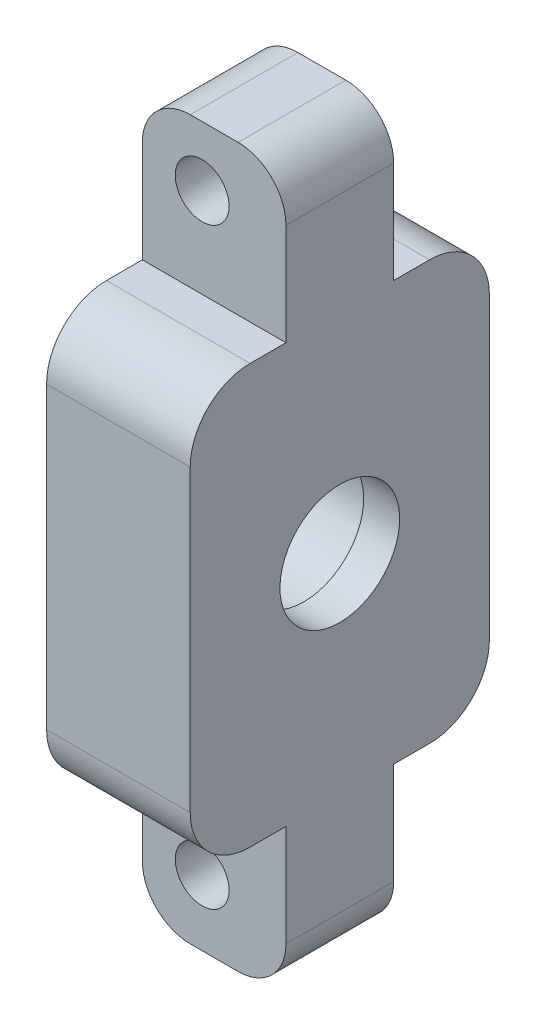
ISO-10303-21;
HEADER;
FILE_DESCRIPTION(('STEP AP214'),'2;1');
FILE_NAME('part.step','',(''),(''),'','','');
FILE_SCHEMA(('AUTOMOTIVE_DESIGN { 1 0 10303 214 1 1 1 1 }'));
ENDSEC;
DATA;
#1=APPLICATION_CONTEXT('core data for automotive mechanical design processes');
#2=APPLICATION_PROTOCOL_DEFINITION('international standard','automotive_design',2000,#1);
#3=PRODUCT_CONTEXT('',#1,'mechanical');
#4=PRODUCT('Part','Part','',(#3));
#5=PRODUCT_RELATED_PRODUCT_CATEGORY('part','',(#4));
#6=PRODUCT_DEFINITION_FORMATION('','',#4);
#7=PRODUCT_DEFINITION_CONTEXT('part definition',#1,'design');
#8=PRODUCT_DEFINITION('design','',#6,#7);
#9=PRODUCT_DEFINITION_SHAPE('','',#8);
#10=(LENGTH_UNIT() NAMED_UNIT(*) SI_UNIT(.MILLI.,.METRE.));
#11=(NAMED_UNIT(*) PLANE_ANGLE_UNIT() SI_UNIT($,.RADIAN.));
#12=(NAMED_UNIT(*) SI_UNIT($,.STERADIAN.) SOLID_ANGLE_UNIT());
#13=UNCERTAINTY_MEASURE_WITH_UNIT(LENGTH_MEASURE(1.E-05),#10,'distance_accuracy_value','');
#14=(GEOMETRIC_REPRESENTATION_CONTEXT(3) GLOBAL_UNCERTAINTY_ASSIGNED_CONTEXT((#13)) GLOBAL_UNIT_ASSIGNED_CONTEXT((#10,
#11,#12)) REPRESENTATION_CONTEXT('',''));
#15=CARTESIAN_POINT('',(0.,0.,0.));
#16=DIRECTION('',(0.,0.,1.));
#17=DIRECTION('',(1.,0.,0.));
#18=AXIS2_PLACEMENT_3D('',#15,#16,#17);
#19=CARTESIAN_POINT('',(6.,0.,0.));
#20=DIRECTION('',(-1.,0.,0.));
#21=DIRECTION('',(0.,-1.,0.));
#22=AXIS2_PLACEMENT_3D('',#19,#20,#21);
#23=CYLINDRICAL_SURFACE('',#22,5.);
#24=CARTESIAN_POINT('',(6.,0.,0.));
#25=DIRECTION('',(-1.,0.,0.));
#26=DIRECTION('',(0.,-1.,0.));
#27=AXIS2_PLACEMENT_3D('',#24,#25,#26);
#28=CIRCLE('',#27,5.);
#29=CARTESIAN_POINT('',(6.,-5.,0.));
#30=VERTEX_POINT('',#29);
#31=EDGE_CURVE('E404',#30,#30,#28,.T.);
#32=ORIENTED_EDGE('',*,*,#31,.F.);
#33=EDGE_LOOP('',(#32));
#34=FACE_BOUND('',#33,.T.);
#35=CARTESIAN_POINT('',(3.,0.,0.));
#36=DIRECTION('',(-1.,0.,0.));
#37=DIRECTION('',(0.,-1.,0.));
#38=AXIS2_PLACEMENT_3D('',#35,#36,#37);
#39=CIRCLE('',#38,5.);
#40=CARTESIAN_POINT('',(3.,-5.,0.));
#41=VERTEX_POINT('',#40);
#42=EDGE_CURVE('E47',#41,#41,#39,.F.);
#43=ORIENTED_EDGE('',*,*,#42,.F.);
#44=EDGE_LOOP('',(#43));
#45=FACE_BOUND('',#44,.T.);
#46=ADVANCED_FACE('F44',(#34,#45),#23,.F.);
#47=CARTESIAN_POINT('',(6.,30.,12.5));
#48=DIRECTION('',(-1.,0.,0.));
#49=DIRECTION('',(0.,-1.,0.));
#50=AXIS2_PLACEMENT_3D('',#47,#48,#49);
#51=PLANE('',#50);
#52=ORIENTED_EDGE('',*,*,#31,.T.);
#53=EDGE_LOOP('',(#52));
#54=FACE_BOUND('',#53,.T.);
#55=DIRECTION('',(0.,1.,0.));
#56=VECTOR('',#55,1.);
#57=CARTESIAN_POINT('',(6.,0.,4.5));
#58=LINE('',#57,#56);
#59=CARTESIAN_POINT('',(6.,-26.,4.5));
#60=VERTEX_POINT('',#59);
#61=CARTESIAN_POINT('',(6.,-17.5,4.5));
#62=VERTEX_POINT('',#61);
#63=EDGE_CURVE('E267',#60,#62,#58,.T.);
#64=ORIENTED_EDGE('',*,*,#63,.F.);
#65=DIRECTION('',(0.,0.,-1.));
#66=VECTOR('',#65,1.);
#67=CARTESIAN_POINT('',(6.,-26.,12.5));
#68=LINE('',#67,#66);
#69=CARTESIAN_POINT('',(6.,-26.,-4.5));
#70=VERTEX_POINT('',#69);
#71=EDGE_CURVE('E354',#60,#70,#68,.T.);
#72=ORIENTED_EDGE('',*,*,#71,.T.);
#73=DIRECTION('',(0.,1.,0.));
#74=VECTOR('',#73,1.);
#75=CARTESIAN_POINT('',(6.,0.,-4.5));
#76=LINE('',#75,#74);
#77=CARTESIAN_POINT('',(6.,-17.5,-4.5));
#78=VERTEX_POINT('',#77);
#79=EDGE_CURVE('E207',#70,#78,#76,.T.);
#80=ORIENTED_EDGE('',*,*,#79,.T.);
#81=DIRECTION('',(0.,0.,1.));
#82=VECTOR('',#81,1.);
#83=CARTESIAN_POINT('',(6.,-17.5,0.));
#84=LINE('',#83,#82);
#85=CARTESIAN_POINT('',(6.,-17.5,-7.5));
#86=VERTEX_POINT('',#85);
#87=EDGE_CURVE('E214',#86,#78,#84,.T.);
#88=ORIENTED_EDGE('',*,*,#87,.F.);
#89=CARTESIAN_POINT('',(6.,-12.5,-7.5));
#90=DIRECTION('',(-1.,0.,0.));
#91=DIRECTION('',(0.,-1.,0.));
#92=AXIS2_PLACEMENT_3D('',#89,#90,#91);
#93=CIRCLE('',#92,5.);
#94=CARTESIAN_POINT('',(6.,-12.5,-12.5));
#95=VERTEX_POINT('',#94);
#96=EDGE_CURVE('E313',#86,#95,#93,.F.);
#97=ORIENTED_EDGE('',*,*,#96,.T.);
#98=DIRECTION('',(0.,1.,0.));
#99=VECTOR('',#98,1.);
#100=CARTESIAN_POINT('',(6.,30.,-12.5));
#101=LINE('',#100,#99);
#102=CARTESIAN_POINT('',(6.,12.5,-12.5));
#103=VERTEX_POINT('',#102);
#104=EDGE_CURVE('E283',#95,#103,#101,.T.);
#105=ORIENTED_EDGE('',*,*,#104,.T.);
#106=CARTESIAN_POINT('',(6.,12.5,-7.5));
#107=DIRECTION('',(-1.,0.,0.));
#108=DIRECTION('',(0.,-1.,0.));
#109=AXIS2_PLACEMENT_3D('',#106,#107,#108);
#110=CIRCLE('',#109,5.);
#111=CARTESIAN_POINT('',(6.,17.5,-7.5));
#112=VERTEX_POINT('',#111);
#113=EDGE_CURVE('E311',#103,#112,#110,.F.);
#114=ORIENTED_EDGE('',*,*,#113,.T.);
#115=DIRECTION('',(0.,0.,1.));
#116=VECTOR('',#115,1.);
#117=CARTESIAN_POINT('',(6.,17.5,0.));
#118=LINE('',#117,#116);
#119=CARTESIAN_POINT('',(6.,17.5,-4.5));
#120=VERTEX_POINT('',#119);
#121=EDGE_CURVE('E233',#112,#120,#118,.T.);
#122=ORIENTED_EDGE('',*,*,#121,.T.);
#123=DIRECTION('',(0.,-1.,0.));
#124=VECTOR('',#123,1.);
#125=CARTESIAN_POINT('',(6.,0.,-4.5));
#126=LINE('',#125,#124);
#127=CARTESIAN_POINT('',(6.,26.,-4.5));
#128=VERTEX_POINT('',#127);
#129=EDGE_CURVE('E227',#128,#120,#126,.T.);
#130=ORIENTED_EDGE('',*,*,#129,.F.);
#131=DIRECTION('',(0.,0.,-1.));
#132=VECTOR('',#131,1.);
#133=CARTESIAN_POINT('',(6.,26.,12.5));
#134=LINE('',#133,#132);
#135=CARTESIAN_POINT('',(6.,26.,4.5));
#136=VERTEX_POINT('',#135);
#137=EDGE_CURVE('E353',#128,#136,#134,.F.);
#138=ORIENTED_EDGE('',*,*,#137,.T.);
#139=DIRECTION('',(0.,-1.,0.));
#140=VECTOR('',#139,1.);
#141=CARTESIAN_POINT('',(6.,0.,4.5));
#142=LINE('',#141,#140);
#143=CARTESIAN_POINT('',(6.,17.5,4.5));
#144=VERTEX_POINT('',#143);
#145=EDGE_CURVE('E249',#136,#144,#142,.T.);
#146=ORIENTED_EDGE('',*,*,#145,.T.);
#147=DIRECTION('',(0.,0.,-1.));
#148=VECTOR('',#147,1.);
#149=CARTESIAN_POINT('',(6.,17.5,0.));
#150=LINE('',#149,#148);
#151=CARTESIAN_POINT('',(6.,17.5,7.5));
#152=VERTEX_POINT('',#151);
#153=EDGE_CURVE('E251',#152,#144,#150,.T.);
#154=ORIENTED_EDGE('',*,*,#153,.F.);
#155=CARTESIAN_POINT('',(6.,12.5,7.5));
#156=DIRECTION('',(-1.,0.,0.));
#157=DIRECTION('',(0.,-1.,0.));
#158=AXIS2_PLACEMENT_3D('',#155,#156,#157);
#159=CIRCLE('',#158,5.);
#160=CARTESIAN_POINT('',(6.,12.5,12.5));
#161=VERTEX_POINT('',#160);
#162=EDGE_CURVE('E308',#152,#161,#159,.F.);
#163=ORIENTED_EDGE('',*,*,#162,.T.);
#164=DIRECTION('',(0.,1.,0.));
#165=VECTOR('',#164,1.);
#166=CARTESIAN_POINT('',(6.,30.,12.5));
#167=LINE('',#166,#165);
#168=CARTESIAN_POINT('',(6.,-12.5,12.5));
#169=VERTEX_POINT('',#168);
#170=EDGE_CURVE('E290',#169,#161,#167,.T.);
#171=ORIENTED_EDGE('',*,*,#170,.F.);
#172=CARTESIAN_POINT('',(6.,-12.5,7.5));
#173=DIRECTION('',(-1.,0.,0.));
#174=DIRECTION('',(0.,-1.,0.));
#175=AXIS2_PLACEMENT_3D('',#172,#173,#174);
#176=CIRCLE('',#175,5.);
#177=CARTESIAN_POINT('',(6.,-17.5,7.5));
#178=VERTEX_POINT('',#177);
#179=EDGE_CURVE('E320',#169,#178,#176,.F.);
#180=ORIENTED_EDGE('',*,*,#179,.T.);
#181=DIRECTION('',(0.,0.,-1.));
#182=VECTOR('',#181,1.);
#183=CARTESIAN_POINT('',(6.,-17.5,0.));
#184=LINE('',#183,#182);
#185=EDGE_CURVE('E218',#178,#62,#184,.T.);
#186=ORIENTED_EDGE('',*,*,#185,.T.);
#187=EDGE_LOOP('',(#64,#72,#80,#88,#97,#105,#114,#122,#130,#138,#146,#154,#163,#171,#180,#186));
#188=FACE_BOUND('',#187,.T.);
#189=ADVANCED_FACE('F451',(#54,#188),#51,.F.);
#190=CARTESIAN_POINT('',(-6.,30.,12.5));
#191=DIRECTION('',(0.,-1.,0.));
#192=DIRECTION('',(0.,0.,-1.));
#193=AXIS2_PLACEMENT_3D('',#190,#191,#192);
#194=PLANE('',#193);
#195=DIRECTION('',(1.,0.,0.));
#196=VECTOR('',#195,1.);
#197=CARTESIAN_POINT('',(-6.00000000000001,30.,-4.5));
#198=LINE('',#197,#196);
#199=CARTESIAN_POINT('',(-2.,30.,-4.5));
#200=VERTEX_POINT('',#199);
#201=CARTESIAN_POINT('',(2.,30.,-4.5));
#202=VERTEX_POINT('',#201);
#203=EDGE_CURVE('E229',#200,#202,#198,.T.);
#204=ORIENTED_EDGE('',*,*,#203,.F.);
#205=DIRECTION('',(0.,0.,-1.));
#206=VECTOR('',#205,1.);
#207=CARTESIAN_POINT('',(-2.,30.,12.5));
#208=LINE('',#207,#206);
#209=CARTESIAN_POINT('',(-2.,30.,4.5));
#210=VERTEX_POINT('',#209);
#211=EDGE_CURVE('E68',#200,#210,#208,.F.);
#212=ORIENTED_EDGE('',*,*,#211,.T.);
#213=DIRECTION('',(1.,0.,0.));
#214=VECTOR('',#213,1.);
#215=CARTESIAN_POINT('',(-6.00000000000001,30.,4.5));
#216=LINE('',#215,#214);
#217=CARTESIAN_POINT('',(2.,30.,4.5));
#218=VERTEX_POINT('',#217);
#219=EDGE_CURVE('E232',#210,#218,#216,.T.);
#220=ORIENTED_EDGE('',*,*,#219,.T.);
#221=DIRECTION('',(0.,0.,-1.));
#222=VECTOR('',#221,1.);
#223=CARTESIAN_POINT('',(2.,30.,12.5));
#224=LINE('',#223,#222);
#225=EDGE_CURVE('E388',#218,#202,#224,.T.);
#226=ORIENTED_EDGE('',*,*,#225,.T.);
#227=EDGE_LOOP('',(#204,#212,#220,#226));
#228=FACE_BOUND('',#227,.T.);
#229=ADVANCED_FACE('F460',(#228),#194,.F.);
#230=CARTESIAN_POINT('',(-6.,30.,12.5));
#231=DIRECTION('',(1.,0.,0.));
#232=DIRECTION('',(0.,1.,0.));
#233=AXIS2_PLACEMENT_3D('',#230,#231,#232);
#234=PLANE('',#233);
#235=CARTESIAN_POINT('',(-6.,0.,0.));
#236=DIRECTION('',(-1.,0.,0.));
#237=DIRECTION('',(0.,-1.,0.));
#238=AXIS2_PLACEMENT_3D('',#235,#236,#237);
#239=CIRCLE('',#238,7.5);
#240=CARTESIAN_POINT('',(-6.,-7.5,0.));
#241=VERTEX_POINT('',#240);
#242=EDGE_CURVE('E411',#241,#241,#239,.T.);
#243=ORIENTED_EDGE('',*,*,#242,.F.);
#244=EDGE_LOOP('',(#243));
#245=FACE_BOUND('',#244,.T.);
#246=DIRECTION('',(0.,1.,0.));
#247=VECTOR('',#246,1.);
#248=CARTESIAN_POINT('',(-6.00000000000001,0.,-4.5));
#249=LINE('',#248,#247);
#250=CARTESIAN_POINT('',(-6.,-26.,-4.5));
#251=VERTEX_POINT('',#250);
#252=CARTESIAN_POINT('',(-6.,-17.5,-4.5));
#253=VERTEX_POINT('',#252);
#254=EDGE_CURVE('E183',#251,#253,#249,.T.);
#255=ORIENTED_EDGE('',*,*,#254,.F.);
#256=DIRECTION('',(0.,0.,-1.));
#257=VECTOR('',#256,1.);
#258=CARTESIAN_POINT('',(-6.,-26.,12.5));
#259=LINE('',#258,#257);
#260=CARTESIAN_POINT('',(-6.,-26.,4.5));
#261=VERTEX_POINT('',#260);
#262=EDGE_CURVE('E379',#251,#261,#259,.F.);
#263=ORIENTED_EDGE('',*,*,#262,.T.);
#264=DIRECTION('',(0.,1.,0.));
#265=VECTOR('',#264,1.);
#266=CARTESIAN_POINT('',(-6.00000000000001,0.,4.5));
#267=LINE('',#266,#265);
#268=CARTESIAN_POINT('',(-6.,-17.5,4.5));
#269=VERTEX_POINT('',#268);
#270=EDGE_CURVE('E269',#261,#269,#267,.T.);
#271=ORIENTED_EDGE('',*,*,#270,.T.);
#272=DIRECTION('',(0.,0.,-1.));
#273=VECTOR('',#272,1.);
#274=CARTESIAN_POINT('',(-6.,-17.5,0.));
#275=LINE('',#274,#273);
#276=CARTESIAN_POINT('',(-6.,-17.5,7.5));
#277=VERTEX_POINT('',#276);
#278=EDGE_CURVE('E261',#277,#269,#275,.T.);
#279=ORIENTED_EDGE('',*,*,#278,.F.);
#280=CARTESIAN_POINT('',(-6.,-12.5,7.5));
#281=DIRECTION('',(1.,0.,0.));
#282=DIRECTION('',(0.,1.,0.));
#283=AXIS2_PLACEMENT_3D('',#280,#281,#282);
#284=CIRCLE('',#283,5.);
#285=CARTESIAN_POINT('',(-6.,-12.5,12.5));
#286=VERTEX_POINT('',#285);
#287=EDGE_CURVE('E333',#277,#286,#284,.F.);
#288=ORIENTED_EDGE('',*,*,#287,.T.);
#289=DIRECTION('',(0.,-1.,0.));
#290=VECTOR('',#289,1.);
#291=CARTESIAN_POINT('',(-6.,30.,12.5));
#292=LINE('',#291,#290);
#293=CARTESIAN_POINT('',(-6.,12.5,12.5));
#294=VERTEX_POINT('',#293);
#295=EDGE_CURVE('E293',#294,#286,#292,.T.);
#296=ORIENTED_EDGE('',*,*,#295,.F.);
#297=CARTESIAN_POINT('',(-6.,12.5,7.5));
#298=DIRECTION('',(1.,0.,0.));
#299=DIRECTION('',(0.,1.,0.));
#300=AXIS2_PLACEMENT_3D('',#297,#298,#299);
#301=CIRCLE('',#300,5.);
#302=CARTESIAN_POINT('',(-6.00000000000001,17.5,7.5));
#303=VERTEX_POINT('',#302);
#304=EDGE_CURVE('E325',#294,#303,#301,.F.);
#305=ORIENTED_EDGE('',*,*,#304,.T.);
#306=DIRECTION('',(0.,0.,-1.));
#307=VECTOR('',#306,1.);
#308=CARTESIAN_POINT('',(-6.00000000000001,17.5,0.));
#309=LINE('',#308,#307);
#310=CARTESIAN_POINT('',(-6.00000000000001,17.5,4.5));
#311=VERTEX_POINT('',#310);
#312=EDGE_CURVE('E244',#303,#311,#309,.T.);
#313=ORIENTED_EDGE('',*,*,#312,.T.);
#314=DIRECTION('',(0.,-1.,0.));
#315=VECTOR('',#314,1.);
#316=CARTESIAN_POINT('',(-6.00000000000001,0.,4.5));
#317=LINE('',#316,#315);
#318=CARTESIAN_POINT('',(-6.00000000000001,26.,4.5));
#319=VERTEX_POINT('',#318);
#320=EDGE_CURVE('E248',#319,#311,#317,.T.);
#321=ORIENTED_EDGE('',*,*,#320,.F.);
#322=DIRECTION('',(0.,0.,-1.));
#323=VECTOR('',#322,1.);
#324=CARTESIAN_POINT('',(-6.,26.,12.5));
#325=LINE('',#324,#323);
#326=CARTESIAN_POINT('',(-6.00000000000001,26.,-4.5));
#327=VERTEX_POINT('',#326);
#328=EDGE_CURVE('E376',#319,#327,#325,.T.);
#329=ORIENTED_EDGE('',*,*,#328,.T.);
#330=DIRECTION('',(0.,-1.,0.));
#331=VECTOR('',#330,1.);
#332=CARTESIAN_POINT('',(-6.00000000000001,0.,-4.5));
#333=LINE('',#332,#331);
#334=CARTESIAN_POINT('',(-6.00000000000001,17.5,-4.5));
#335=VERTEX_POINT('',#334);
#336=EDGE_CURVE('E228',#327,#335,#333,.T.);
#337=ORIENTED_EDGE('',*,*,#336,.T.);
#338=DIRECTION('',(0.,0.,1.));
#339=VECTOR('',#338,1.);
#340=CARTESIAN_POINT('',(-6.00000000000001,17.5,0.));
#341=LINE('',#340,#339);
#342=CARTESIAN_POINT('',(-6.00000000000001,17.5,-7.5));
#343=VERTEX_POINT('',#342);
#344=EDGE_CURVE('E225',#343,#335,#341,.T.);
#345=ORIENTED_EDGE('',*,*,#344,.F.);
#346=CARTESIAN_POINT('',(-6.,12.5,-7.5));
#347=DIRECTION('',(1.,0.,0.));
#348=DIRECTION('',(0.,1.,0.));
#349=AXIS2_PLACEMENT_3D('',#346,#347,#348);
#350=CIRCLE('',#349,5.);
#351=CARTESIAN_POINT('',(-6.,12.5,-12.5));
#352=VERTEX_POINT('',#351);
#353=EDGE_CURVE('E327',#343,#352,#350,.F.);
#354=ORIENTED_EDGE('',*,*,#353,.T.);
#355=DIRECTION('',(0.,-1.,0.));
#356=VECTOR('',#355,1.);
#357=CARTESIAN_POINT('',(-6.,30.,-12.5));
#358=LINE('',#357,#356);
#359=CARTESIAN_POINT('',(-6.,-12.5,-12.5));
#360=VERTEX_POINT('',#359);
#361=EDGE_CURVE('E292',#352,#360,#358,.T.);
#362=ORIENTED_EDGE('',*,*,#361,.T.);
#363=CARTESIAN_POINT('',(-6.,-12.5,-7.5));
#364=DIRECTION('',(1.,0.,0.));
#365=DIRECTION('',(0.,1.,0.));
#366=AXIS2_PLACEMENT_3D('',#363,#364,#365);
#367=CIRCLE('',#366,5.);
#368=CARTESIAN_POINT('',(-6.,-17.5,-7.5));
#369=VERTEX_POINT('',#368);
#370=EDGE_CURVE('E203',#360,#369,#367,.F.);
#371=ORIENTED_EDGE('',*,*,#370,.T.);
#372=DIRECTION('',(0.,0.,1.));
#373=VECTOR('',#372,1.);
#374=CARTESIAN_POINT('',(-6.,-17.5,0.));
#375=LINE('',#374,#373);
#376=EDGE_CURVE('E192',#369,#253,#375,.T.);
#377=ORIENTED_EDGE('',*,*,#376,.T.);
#378=EDGE_LOOP('',(#255,#263,#271,#279,#288,#296,#305,#313,#321,#329,#337,#345,#354,#362,#371,#377));
#379=FACE_BOUND('',#378,.T.);
#380=ADVANCED_FACE('F198',(#245,#379),#234,.F.);
#381=CARTESIAN_POINT('',(-6.,-30.,12.5));
#382=DIRECTION('',(0.,1.,0.));
#383=DIRECTION('',(0.,0.,1.));
#384=AXIS2_PLACEMENT_3D('',#381,#382,#383);
#385=PLANE('',#384);
#386=DIRECTION('',(1.,0.,0.));
#387=VECTOR('',#386,1.);
#388=CARTESIAN_POINT('',(-6.,-30.,-4.5));
#389=LINE('',#388,#387);
#390=CARTESIAN_POINT('',(-2.,-30.,-4.5));
#391=VERTEX_POINT('',#390);
#392=CARTESIAN_POINT('',(2.,-30.,-4.5));
#393=VERTEX_POINT('',#392);
#394=EDGE_CURVE('E215',#391,#393,#389,.T.);
#395=ORIENTED_EDGE('',*,*,#394,.T.);
#396=DIRECTION('',(0.,0.,-1.));
#397=VECTOR('',#396,1.);
#398=CARTESIAN_POINT('',(2.,-30.,12.5));
#399=LINE('',#398,#397);
#400=CARTESIAN_POINT('',(2.,-30.,4.5));
#401=VERTEX_POINT('',#400);
#402=EDGE_CURVE('E370',#393,#401,#399,.F.);
#403=ORIENTED_EDGE('',*,*,#402,.T.);
#404=DIRECTION('',(1.,0.,0.));
#405=VECTOR('',#404,1.);
#406=CARTESIAN_POINT('',(-6.,-30.,4.5));
#407=LINE('',#406,#405);
#408=CARTESIAN_POINT('',(-2.,-30.,4.5));
#409=VERTEX_POINT('',#408);
#410=EDGE_CURVE('E271',#409,#401,#407,.T.);
#411=ORIENTED_EDGE('',*,*,#410,.F.);
#412=DIRECTION('',(0.,0.,-1.));
#413=VECTOR('',#412,1.);
#414=CARTESIAN_POINT('',(-2.,-30.,12.5));
#415=LINE('',#414,#413);
#416=EDGE_CURVE('E361',#409,#391,#415,.T.);
#417=ORIENTED_EDGE('',*,*,#416,.T.);
#418=EDGE_LOOP('',(#395,#403,#411,#417));
#419=FACE_BOUND('',#418,.T.);
#420=ADVANCED_FACE('F504',(#419),#385,.F.);
#421=CARTESIAN_POINT('',(0.,0.,12.5));
#422=DIRECTION('',(0.,0.,1.));
#423=DIRECTION('',(1.,0.,0.));
#424=AXIS2_PLACEMENT_3D('',#421,#422,#423);
#425=PLANE('',#424);
#426=ORIENTED_EDGE('',*,*,#295,.T.);
#427=DIRECTION('',(1.,0.,0.));
#428=VECTOR('',#427,1.);
#429=CARTESIAN_POINT('',(0.,-12.5,12.5));
#430=LINE('',#429,#428);
#431=EDGE_CURVE('E302',#286,#169,#430,.T.);
#432=ORIENTED_EDGE('',*,*,#431,.T.);
#433=ORIENTED_EDGE('',*,*,#170,.T.);
#434=DIRECTION('',(1.,0.,0.));
#435=VECTOR('',#434,1.);
#436=CARTESIAN_POINT('',(-6.,12.5,12.5));
#437=LINE('',#436,#435);
#438=EDGE_CURVE('E298',#161,#294,#437,.F.);
#439=ORIENTED_EDGE('',*,*,#438,.T.);
#440=EDGE_LOOP('',(#426,#432,#433,#439));
#441=FACE_BOUND('',#440,.T.);
#442=ADVANCED_FACE('F505',(#441),#425,.T.);
#443=CARTESIAN_POINT('',(0.,0.,-12.5));
#444=DIRECTION('',(0.,0.,1.));
#445=DIRECTION('',(1.,0.,0.));
#446=AXIS2_PLACEMENT_3D('',#443,#444,#445);
#447=PLANE('',#446);
#448=ORIENTED_EDGE('',*,*,#104,.F.);
#449=DIRECTION('',(1.,0.,0.));
#450=VECTOR('',#449,1.);
#451=CARTESIAN_POINT('',(0.,-12.5,-12.5));
#452=LINE('',#451,#450);
#453=EDGE_CURVE('E344',#95,#360,#452,.F.);
#454=ORIENTED_EDGE('',*,*,#453,.T.);
#455=ORIENTED_EDGE('',*,*,#361,.F.);
#456=DIRECTION('',(1.,0.,0.));
#457=VECTOR('',#456,1.);
#458=CARTESIAN_POINT('',(6.,12.5,-12.5));
#459=LINE('',#458,#457);
#460=EDGE_CURVE('E340',#352,#103,#459,.T.);
#461=ORIENTED_EDGE('',*,*,#460,.T.);
#462=EDGE_LOOP('',(#448,#454,#455,#461));
#463=FACE_BOUND('',#462,.T.);
#464=ADVANCED_FACE('F472',(#463),#447,.F.);
#465=CARTESIAN_POINT('',(-6.00000000000001,0.,-4.5));
#466=DIRECTION('',(0.,0.,-1.));
#467=DIRECTION('',(0.,1.,0.));
#468=AXIS2_PLACEMENT_3D('',#465,#466,#467);
#469=PLANE('',#468);
#470=CARTESIAN_POINT('',(-1.,-24.5,-4.5));
#471=DIRECTION('',(0.,0.,-1.));
#472=DIRECTION('',(0.,1.,0.));
#473=AXIS2_PLACEMENT_3D('',#470,#471,#472);
#474=CIRCLE('',#473,2.25);
#475=CARTESIAN_POINT('',(-1.,-22.25,-4.5));
#476=VERTEX_POINT('',#475);
#477=EDGE_CURVE('E260',#476,#476,#474,.T.);
#478=ORIENTED_EDGE('',*,*,#477,.F.);
#479=EDGE_LOOP('',(#478));
#480=FACE_BOUND('',#479,.T.);
#481=ORIENTED_EDGE('',*,*,#79,.F.);
#482=CARTESIAN_POINT('',(2.,-26.,-4.5));
#483=DIRECTION('',(0.,0.,-1.));
#484=DIRECTION('',(0.,1.,0.));
#485=AXIS2_PLACEMENT_3D('',#482,#483,#484);
#486=CIRCLE('',#485,4.);
#487=EDGE_CURVE('E359',#70,#393,#486,.T.);
#488=ORIENTED_EDGE('',*,*,#487,.T.);
#489=ORIENTED_EDGE('',*,*,#394,.F.);
#490=CARTESIAN_POINT('',(-2.,-26.,-4.5));
#491=DIRECTION('',(0.,0.,-1.));
#492=DIRECTION('',(0.,1.,0.));
#493=AXIS2_PLACEMENT_3D('',#490,#491,#492);
#494=CIRCLE('',#493,4.);
#495=EDGE_CURVE('E194',#391,#251,#494,.T.);
#496=ORIENTED_EDGE('',*,*,#495,.T.);
#497=ORIENTED_EDGE('',*,*,#254,.T.);
#498=DIRECTION('',(1.,0.,0.));
#499=VECTOR('',#498,1.);
#500=CARTESIAN_POINT('',(-6.,-17.5,-4.5));
#501=LINE('',#500,#499);
#502=EDGE_CURVE('E186',#253,#78,#501,.T.);
#503=ORIENTED_EDGE('',*,*,#502,.T.);
#504=EDGE_LOOP('',(#481,#488,#489,#496,#497,#503));
#505=FACE_BOUND('',#504,.T.);
#506=ADVANCED_FACE('F190',(#480,#505),#469,.T.);
#507=CARTESIAN_POINT('',(-6.,-17.5,0.));
#508=DIRECTION('',(0.,1.,0.));
#509=DIRECTION('',(-1.,0.,0.));
#510=AXIS2_PLACEMENT_3D('',#507,#508,#509);
#511=PLANE('',#510);
#512=ORIENTED_EDGE('',*,*,#376,.F.);
#513=DIRECTION('',(1.,0.,0.));
#514=VECTOR('',#513,1.);
#515=CARTESIAN_POINT('',(-6.,-17.5,-7.5));
#516=LINE('',#515,#514);
#517=EDGE_CURVE('E334',#369,#86,#516,.T.);
#518=ORIENTED_EDGE('',*,*,#517,.T.);
#519=ORIENTED_EDGE('',*,*,#87,.T.);
#520=ORIENTED_EDGE('',*,*,#502,.F.);
#521=EDGE_LOOP('',(#512,#518,#519,#520));
#522=FACE_BOUND('',#521,.T.);
#523=ADVANCED_FACE('F209',(#522),#511,.F.);
#524=CARTESIAN_POINT('',(-6.00000000000001,17.5,0.));
#525=DIRECTION('',(0.,1.,0.));
#526=DIRECTION('',(-1.,0.,0.));
#527=AXIS2_PLACEMENT_3D('',#524,#525,#526);
#528=PLANE('',#527);
#529=ORIENTED_EDGE('',*,*,#121,.F.);
#530=DIRECTION('',(1.,0.,0.));
#531=VECTOR('',#530,1.);
#532=CARTESIAN_POINT('',(-6.00000000000001,17.5,-7.5));
#533=LINE('',#532,#531);
#534=EDGE_CURVE('E343',#112,#343,#533,.F.);
#535=ORIENTED_EDGE('',*,*,#534,.T.);
#536=ORIENTED_EDGE('',*,*,#344,.T.);
#537=DIRECTION('',(1.,0.,0.));
#538=VECTOR('',#537,1.);
#539=CARTESIAN_POINT('',(-6.00000000000001,17.5,-4.5));
#540=LINE('',#539,#538);
#541=EDGE_CURVE('E238',#335,#120,#540,.T.);
#542=ORIENTED_EDGE('',*,*,#541,.T.);
#543=EDGE_LOOP('',(#529,#535,#536,#542));
#544=FACE_BOUND('',#543,.T.);
#545=ADVANCED_FACE('F479',(#544),#528,.T.);
#546=CARTESIAN_POINT('',(-6.00000000000001,0.,-4.5));
#547=DIRECTION('',(0.,0.,1.));
#548=DIRECTION('',(0.,-1.,0.));
#549=AXIS2_PLACEMENT_3D('',#546,#547,#548);
#550=PLANE('',#549);
#551=CARTESIAN_POINT('',(-1.00000000000001,25.,-4.5));
#552=DIRECTION('',(0.,0.,1.));
#553=DIRECTION('',(0.,-1.,0.));
#554=AXIS2_PLACEMENT_3D('',#551,#552,#553);
#555=CIRCLE('',#554,2.25);
#556=CARTESIAN_POINT('',(-1.00000000000001,22.75,-4.5));
#557=VERTEX_POINT('',#556);
#558=EDGE_CURVE('E400',#557,#557,#555,.T.);
#559=ORIENTED_EDGE('',*,*,#558,.T.);
#560=EDGE_LOOP('',(#559));
#561=FACE_BOUND('',#560,.T.);
#562=ORIENTED_EDGE('',*,*,#336,.F.);
#563=CARTESIAN_POINT('',(-2.,26.,-4.5));
#564=DIRECTION('',(0.,0.,1.));
#565=DIRECTION('',(0.,-1.,0.));
#566=AXIS2_PLACEMENT_3D('',#563,#564,#565);
#567=CIRCLE('',#566,4.);
#568=EDGE_CURVE('E389',#327,#200,#567,.F.);
#569=ORIENTED_EDGE('',*,*,#568,.T.);
#570=ORIENTED_EDGE('',*,*,#203,.T.);
#571=CARTESIAN_POINT('',(2.,26.,-4.5));
#572=DIRECTION('',(0.,0.,1.));
#573=DIRECTION('',(0.,-1.,0.));
#574=AXIS2_PLACEMENT_3D('',#571,#572,#573);
#575=CIRCLE('',#574,4.);
#576=EDGE_CURVE('E384',#202,#128,#575,.F.);
#577=ORIENTED_EDGE('',*,*,#576,.T.);
#578=ORIENTED_EDGE('',*,*,#129,.T.);
#579=ORIENTED_EDGE('',*,*,#541,.F.);
#580=EDGE_LOOP('',(#562,#569,#570,#577,#578,#579));
#581=FACE_BOUND('',#580,.T.);
#582=ADVANCED_FACE('F476',(#561,#581),#550,.F.);
#583=CARTESIAN_POINT('',(-6.,-17.5,0.));
#584=DIRECTION('',(0.,-1.,0.));
#585=DIRECTION('',(1.,0.,0.));
#586=AXIS2_PLACEMENT_3D('',#583,#584,#585);
#587=PLANE('',#586);
#588=ORIENTED_EDGE('',*,*,#185,.F.);
#589=DIRECTION('',(1.,0.,0.));
#590=VECTOR('',#589,1.);
#591=CARTESIAN_POINT('',(-6.,-17.5,7.5));
#592=LINE('',#591,#590);
#593=EDGE_CURVE('E318',#178,#277,#592,.F.);
#594=ORIENTED_EDGE('',*,*,#593,.T.);
#595=ORIENTED_EDGE('',*,*,#278,.T.);
#596=DIRECTION('',(1.,0.,0.));
#597=VECTOR('',#596,1.);
#598=CARTESIAN_POINT('',(-6.,-17.5,4.5));
#599=LINE('',#598,#597);
#600=EDGE_CURVE('E278',#269,#62,#599,.T.);
#601=ORIENTED_EDGE('',*,*,#600,.T.);
#602=EDGE_LOOP('',(#588,#594,#595,#601));
#603=FACE_BOUND('',#602,.T.);
#604=ADVANCED_FACE('F481',(#603),#587,.T.);
#605=CARTESIAN_POINT('',(-6.00000000000001,0.,4.5));
#606=DIRECTION('',(0.,0.,-1.));
#607=DIRECTION('',(0.,1.,0.));
#608=AXIS2_PLACEMENT_3D('',#605,#606,#607);
#609=PLANE('',#608);
#610=CARTESIAN_POINT('',(-1.,-24.5,4.5));
#611=DIRECTION('',(0.,0.,1.));
#612=DIRECTION('',(1.,0.,0.));
#613=AXIS2_PLACEMENT_3D('',#610,#611,#612);
#614=CIRCLE('',#613,2.25);
#615=CARTESIAN_POINT('',(1.24999999999999,-24.5,4.5));
#616=VERTEX_POINT('',#615);
#617=EDGE_CURVE('E405',#616,#616,#614,.T.);
#618=ORIENTED_EDGE('',*,*,#617,.F.);
#619=EDGE_LOOP('',(#618));
#620=FACE_BOUND('',#619,.T.);
#621=ORIENTED_EDGE('',*,*,#410,.T.);
#622=CARTESIAN_POINT('',(2.,-26.,4.5));
#623=DIRECTION('',(0.,0.,-1.));
#624=DIRECTION('',(0.,1.,0.));
#625=AXIS2_PLACEMENT_3D('',#622,#623,#624);
#626=CIRCLE('',#625,4.);
#627=EDGE_CURVE('E373',#401,#60,#626,.F.);
#628=ORIENTED_EDGE('',*,*,#627,.T.);
#629=ORIENTED_EDGE('',*,*,#63,.T.);
#630=ORIENTED_EDGE('',*,*,#600,.F.);
#631=ORIENTED_EDGE('',*,*,#270,.F.);
#632=CARTESIAN_POINT('',(-2.,-26.,4.5));
#633=DIRECTION('',(0.,0.,-1.));
#634=DIRECTION('',(0.,1.,0.));
#635=AXIS2_PLACEMENT_3D('',#632,#633,#634);
#636=CIRCLE('',#635,4.);
#637=EDGE_CURVE('E369',#261,#409,#636,.F.);
#638=ORIENTED_EDGE('',*,*,#637,.T.);
#639=EDGE_LOOP('',(#621,#628,#629,#630,#631,#638));
#640=FACE_BOUND('',#639,.T.);
#641=ADVANCED_FACE('F493',(#620,#640),#609,.F.);
#642=CARTESIAN_POINT('',(-6.00000000000001,0.,4.5));
#643=DIRECTION('',(0.,0.,1.));
#644=DIRECTION('',(0.,-1.,0.));
#645=AXIS2_PLACEMENT_3D('',#642,#643,#644);
#646=PLANE('',#645);
#647=CARTESIAN_POINT('',(-1.00000000000001,25.,4.5));
#648=DIRECTION('',(0.,0.,1.));
#649=DIRECTION('',(1.,0.,0.));
#650=AXIS2_PLACEMENT_3D('',#647,#648,#649);
#651=CIRCLE('',#650,2.25);
#652=CARTESIAN_POINT('',(1.24999999999999,25.,4.5));
#653=VERTEX_POINT('',#652);
#654=EDGE_CURVE('E399',#653,#653,#651,.T.);
#655=ORIENTED_EDGE('',*,*,#654,.F.);
#656=EDGE_LOOP('',(#655));
#657=FACE_BOUND('',#656,.T.);
#658=ORIENTED_EDGE('',*,*,#219,.F.);
#659=CARTESIAN_POINT('',(-2.,26.,4.5));
#660=DIRECTION('',(0.,0.,1.));
#661=DIRECTION('',(0.,-1.,0.));
#662=AXIS2_PLACEMENT_3D('',#659,#660,#661);
#663=CIRCLE('',#662,4.);
#664=EDGE_CURVE('E11',#210,#319,#663,.T.);
#665=ORIENTED_EDGE('',*,*,#664,.T.);
#666=ORIENTED_EDGE('',*,*,#320,.T.);
#667=DIRECTION('',(1.,0.,0.));
#668=VECTOR('',#667,1.);
#669=CARTESIAN_POINT('',(-6.00000000000001,17.5,4.5));
#670=LINE('',#669,#668);
#671=EDGE_CURVE('E254',#311,#144,#670,.T.);
#672=ORIENTED_EDGE('',*,*,#671,.T.);
#673=ORIENTED_EDGE('',*,*,#145,.F.);
#674=CARTESIAN_POINT('',(2.,26.,4.5));
#675=DIRECTION('',(0.,0.,1.));
#676=DIRECTION('',(0.,-1.,0.));
#677=AXIS2_PLACEMENT_3D('',#674,#675,#676);
#678=CIRCLE('',#677,4.);
#679=EDGE_CURVE('E54',#136,#218,#678,.T.);
#680=ORIENTED_EDGE('',*,*,#679,.T.);
#681=EDGE_LOOP('',(#658,#665,#666,#672,#673,#680));
#682=FACE_BOUND('',#681,.T.);
#683=ADVANCED_FACE('F486',(#657,#682),#646,.T.);
#684=CARTESIAN_POINT('',(-6.00000000000001,17.5,0.));
#685=DIRECTION('',(0.,-1.,0.));
#686=DIRECTION('',(1.,0.,0.));
#687=AXIS2_PLACEMENT_3D('',#684,#685,#686);
#688=PLANE('',#687);
#689=ORIENTED_EDGE('',*,*,#312,.F.);
#690=DIRECTION('',(1.,0.,0.));
#691=VECTOR('',#690,1.);
#692=CARTESIAN_POINT('',(6.,17.5,7.5));
#693=LINE('',#692,#691);
#694=EDGE_CURVE('E350',#303,#152,#693,.T.);
#695=ORIENTED_EDGE('',*,*,#694,.T.);
#696=ORIENTED_EDGE('',*,*,#153,.T.);
#697=ORIENTED_EDGE('',*,*,#671,.F.);
#698=EDGE_LOOP('',(#689,#695,#696,#697));
#699=FACE_BOUND('',#698,.T.);
#700=ADVANCED_FACE('F470',(#699),#688,.F.);
#701=CARTESIAN_POINT('',(-1.00000000000001,25.,-12.5));
#702=DIRECTION('',(0.,0.,1.));
#703=DIRECTION('',(1.,0.,0.));
#704=AXIS2_PLACEMENT_3D('',#701,#702,#703);
#705=CYLINDRICAL_SURFACE('',#704,2.25);
#706=ORIENTED_EDGE('',*,*,#654,.T.);
#707=EDGE_LOOP('',(#706));
#708=FACE_BOUND('',#707,.T.);
#709=ORIENTED_EDGE('',*,*,#558,.F.);
#710=EDGE_LOOP('',(#709));
#711=FACE_BOUND('',#710,.T.);
#712=ADVANCED_FACE('F461',(#708,#711),#705,.F.);
#713=CARTESIAN_POINT('',(-1.,-24.5,-12.5));
#714=DIRECTION('',(0.,0.,1.));
#715=DIRECTION('',(1.,0.,0.));
#716=AXIS2_PLACEMENT_3D('',#713,#714,#715);
#717=CYLINDRICAL_SURFACE('',#716,2.25);
#718=ORIENTED_EDGE('',*,*,#477,.T.);
#719=EDGE_LOOP('',(#718));
#720=FACE_BOUND('',#719,.T.);
#721=ORIENTED_EDGE('',*,*,#617,.T.);
#722=EDGE_LOOP('',(#721));
#723=FACE_BOUND('',#722,.T.);
#724=ADVANCED_FACE('F467',(#720,#723),#717,.F.);
#725=CARTESIAN_POINT('',(0.,-12.5,7.5));
#726=DIRECTION('',(1.,0.,0.));
#727=DIRECTION('',(0.,1.,0.));
#728=AXIS2_PLACEMENT_3D('',#725,#726,#727);
#729=CYLINDRICAL_SURFACE('',#728,5.);
#730=ORIENTED_EDGE('',*,*,#287,.F.);
#731=ORIENTED_EDGE('',*,*,#593,.F.);
#732=ORIENTED_EDGE('',*,*,#179,.F.);
#733=ORIENTED_EDGE('',*,*,#431,.F.);
#734=EDGE_LOOP('',(#730,#731,#732,#733));
#735=FACE_BOUND('',#734,.T.);
#736=ADVANCED_FACE('F474',(#735),#729,.T.);
#737=CARTESIAN_POINT('',(-6.00000000000001,-12.5,-7.5));
#738=DIRECTION('',(1.,0.,0.));
#739=DIRECTION('',(0.,1.,0.));
#740=AXIS2_PLACEMENT_3D('',#737,#738,#739);
#741=CYLINDRICAL_SURFACE('',#740,5.);
#742=ORIENTED_EDGE('',*,*,#370,.F.);
#743=ORIENTED_EDGE('',*,*,#453,.F.);
#744=ORIENTED_EDGE('',*,*,#96,.F.);
#745=ORIENTED_EDGE('',*,*,#517,.F.);
#746=EDGE_LOOP('',(#742,#743,#744,#745));
#747=FACE_BOUND('',#746,.T.);
#748=ADVANCED_FACE('F517',(#747),#741,.T.);
#749=CARTESIAN_POINT('',(0.,12.5,-7.5));
#750=DIRECTION('',(-1.,0.,0.));
#751=DIRECTION('',(0.,-1.,0.));
#752=AXIS2_PLACEMENT_3D('',#749,#750,#751);
#753=CYLINDRICAL_SURFACE('',#752,5.);
#754=ORIENTED_EDGE('',*,*,#353,.F.);
#755=ORIENTED_EDGE('',*,*,#534,.F.);
#756=ORIENTED_EDGE('',*,*,#113,.F.);
#757=ORIENTED_EDGE('',*,*,#460,.F.);
#758=EDGE_LOOP('',(#754,#755,#756,#757));
#759=FACE_BOUND('',#758,.T.);
#760=ADVANCED_FACE('F524',(#759),#753,.T.);
#761=CARTESIAN_POINT('',(-6.00000000000001,12.5,7.5));
#762=DIRECTION('',(-1.,0.,0.));
#763=DIRECTION('',(0.,-1.,0.));
#764=AXIS2_PLACEMENT_3D('',#761,#762,#763);
#765=CYLINDRICAL_SURFACE('',#764,5.);
#766=ORIENTED_EDGE('',*,*,#304,.F.);
#767=ORIENTED_EDGE('',*,*,#438,.F.);
#768=ORIENTED_EDGE('',*,*,#162,.F.);
#769=ORIENTED_EDGE('',*,*,#694,.F.);
#770=EDGE_LOOP('',(#766,#767,#768,#769));
#771=FACE_BOUND('',#770,.T.);
#772=ADVANCED_FACE('F526',(#771),#765,.T.);
#773=CARTESIAN_POINT('',(2.,-26.,12.5));
#774=DIRECTION('',(0.,0.,-1.));
#775=DIRECTION('',(-1.,0.,0.));
#776=AXIS2_PLACEMENT_3D('',#773,#774,#775);
#777=CYLINDRICAL_SURFACE('',#776,4.);
#778=ORIENTED_EDGE('',*,*,#627,.F.);
#779=ORIENTED_EDGE('',*,*,#402,.F.);
#780=ORIENTED_EDGE('',*,*,#487,.F.);
#781=ORIENTED_EDGE('',*,*,#71,.F.);
#782=EDGE_LOOP('',(#778,#779,#780,#781));
#783=FACE_BOUND('',#782,.T.);
#784=ADVANCED_FACE('F535',(#783),#777,.T.);
#785=CARTESIAN_POINT('',(-2.,-26.,12.5));
#786=DIRECTION('',(0.,0.,-1.));
#787=DIRECTION('',(-1.,0.,0.));
#788=AXIS2_PLACEMENT_3D('',#785,#786,#787);
#789=CYLINDRICAL_SURFACE('',#788,4.);
#790=ORIENTED_EDGE('',*,*,#637,.F.);
#791=ORIENTED_EDGE('',*,*,#262,.F.);
#792=ORIENTED_EDGE('',*,*,#495,.F.);
#793=ORIENTED_EDGE('',*,*,#416,.F.);
#794=EDGE_LOOP('',(#790,#791,#792,#793));
#795=FACE_BOUND('',#794,.T.);
#796=ADVANCED_FACE('F539',(#795),#789,.T.);
#797=CARTESIAN_POINT('',(-2.,26.,12.5));
#798=DIRECTION('',(0.,0.,-1.));
#799=DIRECTION('',(-1.,0.,0.));
#800=AXIS2_PLACEMENT_3D('',#797,#798,#799);
#801=CYLINDRICAL_SURFACE('',#800,4.);
#802=ORIENTED_EDGE('',*,*,#664,.F.);
#803=ORIENTED_EDGE('',*,*,#211,.F.);
#804=ORIENTED_EDGE('',*,*,#568,.F.);
#805=ORIENTED_EDGE('',*,*,#328,.F.);
#806=EDGE_LOOP('',(#802,#803,#804,#805));
#807=FACE_BOUND('',#806,.T.);
#808=ADVANCED_FACE('F538',(#807),#801,.T.);
#809=CARTESIAN_POINT('',(2.,26.,12.5));
#810=DIRECTION('',(0.,0.,-1.));
#811=DIRECTION('',(-1.,0.,0.));
#812=AXIS2_PLACEMENT_3D('',#809,#810,#811);
#813=CYLINDRICAL_SURFACE('',#812,4.);
#814=ORIENTED_EDGE('',*,*,#679,.F.);
#815=ORIENTED_EDGE('',*,*,#137,.F.);
#816=ORIENTED_EDGE('',*,*,#576,.F.);
#817=ORIENTED_EDGE('',*,*,#225,.F.);
#818=EDGE_LOOP('',(#814,#815,#816,#817));
#819=FACE_BOUND('',#818,.T.);
#820=ADVANCED_FACE('F50',(#819),#813,.T.);
#821=CARTESIAN_POINT('',(-2.,0.,0.));
#822=DIRECTION('',(-1.,0.,0.));
#823=DIRECTION('',(0.,-1.,0.));
#824=AXIS2_PLACEMENT_3D('',#821,#822,#823);
#825=CYLINDRICAL_SURFACE('',#824,7.5);
#826=CARTESIAN_POINT('',(-2.,0.,0.));
#827=DIRECTION('',(-1.,0.,0.));
#828=DIRECTION('',(0.,-1.,0.));
#829=AXIS2_PLACEMENT_3D('',#826,#827,#828);
#830=CIRCLE('',#829,7.5);
#831=CARTESIAN_POINT('',(-2.,-7.5,0.));
#832=VERTEX_POINT('',#831);
#833=EDGE_CURVE('E408',#832,#832,#830,.T.);
#834=ORIENTED_EDGE('',*,*,#833,.F.);
#835=EDGE_LOOP('',(#834));
#836=FACE_BOUND('',#835,.T.);
#837=ORIENTED_EDGE('',*,*,#242,.T.);
#838=EDGE_LOOP('',(#837));
#839=FACE_BOUND('',#838,.T.);
#840=ADVANCED_FACE('F465',(#836,#839),#825,.F.);
#841=CARTESIAN_POINT('',(-2.,0.,0.));
#842=DIRECTION('',(-1.,0.,0.));
#843=DIRECTION('',(0.,-1.,0.));
#844=AXIS2_PLACEMENT_3D('',#841,#842,#843);
#845=PLANE('',#844);
#846=CARTESIAN_POINT('',(-2.,0.,0.));
#847=DIRECTION('',(-1.,0.,0.));
#848=DIRECTION('',(0.,-1.,0.));
#849=AXIS2_PLACEMENT_3D('',#846,#847,#848);
#850=CIRCLE('',#849,5.5);
#851=CARTESIAN_POINT('',(-2.,-5.5,0.));
#852=VERTEX_POINT('',#851);
#853=EDGE_CURVE('E427',#852,#852,#850,.T.);
#854=ORIENTED_EDGE('',*,*,#853,.F.);
#855=EDGE_LOOP('',(#854));
#856=FACE_BOUND('',#855,.T.);
#857=ORIENTED_EDGE('',*,*,#833,.T.);
#858=EDGE_LOOP('',(#857));
#859=FACE_BOUND('',#858,.T.);
#860=ADVANCED_FACE('F449',(#856,#859),#845,.T.);
#861=CARTESIAN_POINT('',(3.,0.,0.));
#862=DIRECTION('',(-1.,0.,0.));
#863=DIRECTION('',(0.,-1.,0.));
#864=AXIS2_PLACEMENT_3D('',#861,#862,#863);
#865=PLANE('',#864);
#866=CARTESIAN_POINT('',(3.,0.,0.));
#867=DIRECTION('',(-1.,0.,0.));
#868=DIRECTION('',(0.,-1.,0.));
#869=AXIS2_PLACEMENT_3D('',#866,#867,#868);
#870=CIRCLE('',#869,5.5);
#871=CARTESIAN_POINT('',(3.,-5.5,0.));
#872=VERTEX_POINT('',#871);
#873=EDGE_CURVE('E429',#872,#872,#870,.T.);
#874=ORIENTED_EDGE('',*,*,#873,.T.);
#875=EDGE_LOOP('',(#874));
#876=FACE_BOUND('',#875,.T.);
#877=ORIENTED_EDGE('',*,*,#42,.T.);
#878=EDGE_LOOP('',(#877));
#879=FACE_BOUND('',#878,.T.);
#880=ADVANCED_FACE('F439',(#876,#879),#865,.T.);
#881=CARTESIAN_POINT('',(3.,0.,0.));
#882=DIRECTION('',(-1.,0.,0.));
#883=DIRECTION('',(0.,-1.,0.));
#884=AXIS2_PLACEMENT_3D('',#881,#882,#883);
#885=CYLINDRICAL_SURFACE('',#884,5.5);
#886=ORIENTED_EDGE('',*,*,#873,.F.);
#887=EDGE_LOOP('',(#886));
#888=FACE_BOUND('',#887,.T.);
#889=ORIENTED_EDGE('',*,*,#853,.T.);
#890=EDGE_LOOP('',(#889));
#891=FACE_BOUND('',#890,.T.);
#892=ADVANCED_FACE('F442',(#888,#891),#885,.F.);
#893=CLOSED_SHELL('',(#46,#189,#229,#380,#420,#442,#464,#506,#523,#545,#582,#604,#641,#683,#700,
#712,#724,#736,#748,#760,#772,#784,#796,#808,#820,#840,#860,#880,#892));
#894=MANIFOLD_SOLID_BREP('B2',#893);
#895=ADVANCED_BREP_SHAPE_REPRESENTATION('',(#18,#894),#14);
#896=SHAPE_DEFINITION_REPRESENTATION(#9,#895);
ENDSEC;
END-ISO-10303-21;
